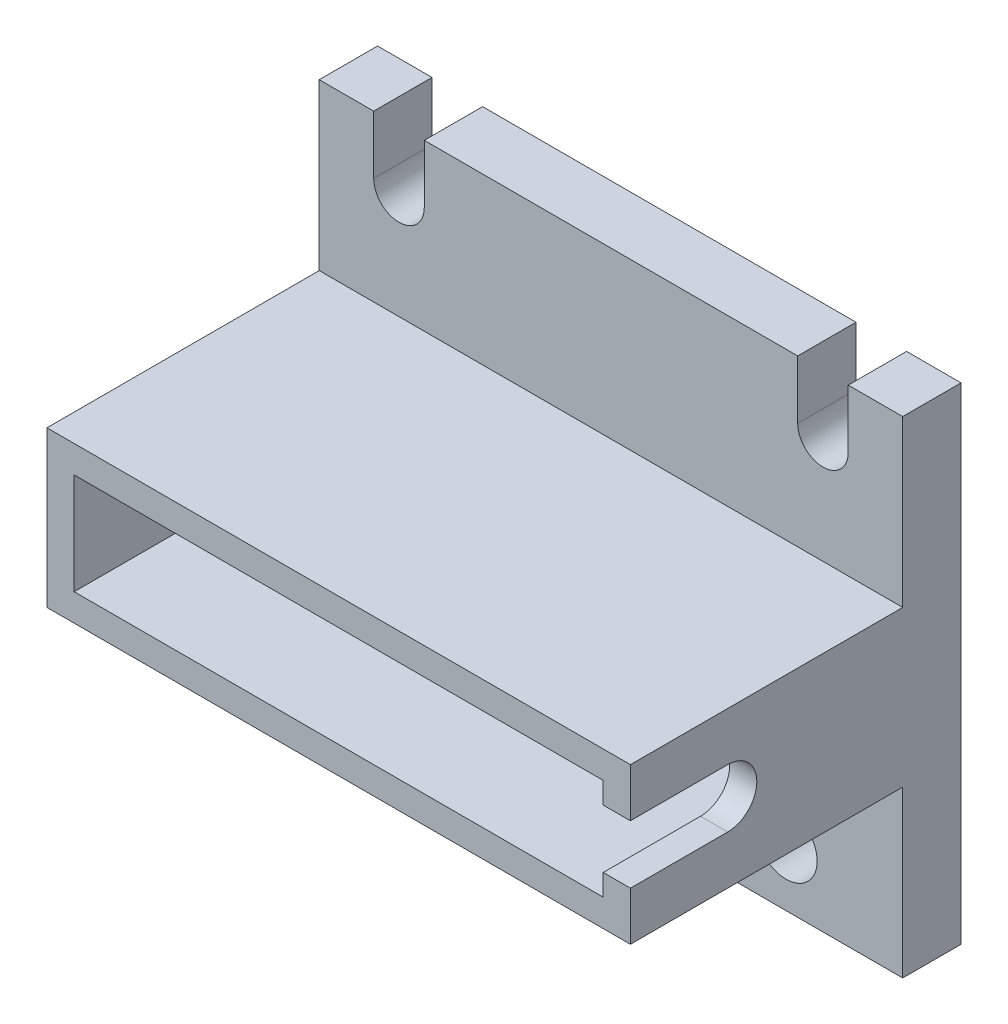
ISO-10303-21;
HEADER;
FILE_DESCRIPTION(('STEP AP214'),'2;1');
FILE_NAME('part.step','',(''),(''),'','','');
FILE_SCHEMA(('AUTOMOTIVE_DESIGN { 1 0 10303 214 1 1 1 1 }'));
ENDSEC;
DATA;
#1=APPLICATION_CONTEXT('core data for automotive mechanical design processes');
#2=APPLICATION_PROTOCOL_DEFINITION('international standard','automotive_design',2000,#1);
#3=PRODUCT_CONTEXT('',#1,'mechanical');
#4=PRODUCT('Part','Part','',(#3));
#5=PRODUCT_RELATED_PRODUCT_CATEGORY('part','',(#4));
#6=PRODUCT_DEFINITION_FORMATION('','',#4);
#7=PRODUCT_DEFINITION_CONTEXT('part definition',#1,'design');
#8=PRODUCT_DEFINITION('design','',#6,#7);
#9=PRODUCT_DEFINITION_SHAPE('','',#8);
#10=(LENGTH_UNIT() NAMED_UNIT(*) SI_UNIT(.MILLI.,.METRE.));
#11=(NAMED_UNIT(*) PLANE_ANGLE_UNIT() SI_UNIT($,.RADIAN.));
#12=(NAMED_UNIT(*) SI_UNIT($,.STERADIAN.) SOLID_ANGLE_UNIT());
#13=UNCERTAINTY_MEASURE_WITH_UNIT(LENGTH_MEASURE(1.E-05),#10,'distance_accuracy_value','');
#14=(GEOMETRIC_REPRESENTATION_CONTEXT(3) GLOBAL_UNCERTAINTY_ASSIGNED_CONTEXT((#13)) GLOBAL_UNIT_ASSIGNED_CONTEXT((#10,
#11,#12)) REPRESENTATION_CONTEXT('',''));
#15=CARTESIAN_POINT('',(0.,0.,0.));
#16=DIRECTION('',(0.,0.,1.));
#17=DIRECTION('',(1.,0.,0.));
#18=AXIS2_PLACEMENT_3D('',#15,#16,#17);
#19=CARTESIAN_POINT('',(-75.,62.5,15.));
#20=DIRECTION('',(0.,-1.,0.));
#21=DIRECTION('',(0.,0.,-1.));
#22=AXIS2_PLACEMENT_3D('',#19,#20,#21);
#23=PLANE('',#22);
#24=DIRECTION('',(-1.,0.,0.));
#25=VECTOR('',#24,1.);
#26=CARTESIAN_POINT('',(-75.,62.5,0.));
#27=LINE('',#26,#25);
#28=CARTESIAN_POINT('',(48.,62.5,0.));
#29=VERTEX_POINT('',#28);
#30=CARTESIAN_POINT('',(-48.,62.5,0.));
#31=VERTEX_POINT('',#30);
#32=EDGE_CURVE('E345',#29,#31,#27,.T.);
#33=ORIENTED_EDGE('',*,*,#32,.T.);
#34=DIRECTION('',(0.,0.,1.));
#35=VECTOR('',#34,1.);
#36=CARTESIAN_POINT('',(-48.,62.5,0.));
#37=LINE('',#36,#35);
#38=CARTESIAN_POINT('',(-48.,62.5,15.));
#39=VERTEX_POINT('',#38);
#40=EDGE_CURVE('E492',#31,#39,#37,.T.);
#41=ORIENTED_EDGE('',*,*,#40,.T.);
#42=DIRECTION('',(-1.,0.,0.));
#43=VECTOR('',#42,1.);
#44=CARTESIAN_POINT('',(-75.,62.5,15.));
#45=LINE('',#44,#43);
#46=CARTESIAN_POINT('',(48.,62.5,15.));
#47=VERTEX_POINT('',#46);
#48=EDGE_CURVE('E310',#47,#39,#45,.T.);
#49=ORIENTED_EDGE('',*,*,#48,.F.);
#50=DIRECTION('',(0.,0.,1.));
#51=VECTOR('',#50,1.);
#52=CARTESIAN_POINT('',(48.,62.5,0.));
#53=LINE('',#52,#51);
#54=EDGE_CURVE('E417',#29,#47,#53,.T.);
#55=ORIENTED_EDGE('',*,*,#54,.F.);
#56=EDGE_LOOP('',(#33,#41,#49,#55));
#57=FACE_BOUND('',#56,.T.);
#58=ADVANCED_FACE('F37',(#57),#23,.F.);
#59=CARTESIAN_POINT('',(0.,0.,15.));
#60=DIRECTION('',(0.,0.,-1.));
#61=DIRECTION('',(-1.,0.,0.));
#62=AXIS2_PLACEMENT_3D('',#59,#60,#61);
#63=PLANE('',#62);
#64=DIRECTION('',(0.,-1.,0.));
#65=VECTOR('',#64,1.);
#66=CARTESIAN_POINT('',(-10.,0.,15.));
#67=LINE('',#66,#65);
#68=CARTESIAN_POINT('',(-9.99999999999999,-20.,15.));
#69=VERTEX_POINT('',#68);
#70=CARTESIAN_POINT('',(-10.,-62.5,15.));
#71=VERTEX_POINT('',#70);
#72=EDGE_CURVE('E391',#69,#71,#67,.T.);
#73=ORIENTED_EDGE('',*,*,#72,.F.);
#74=DIRECTION('',(1.,0.,0.));
#75=VECTOR('',#74,1.);
#76=CARTESIAN_POINT('',(-75.,-20.,15.));
#77=LINE('',#76,#75);
#78=CARTESIAN_POINT('',(-75.,-20.,15.));
#79=VERTEX_POINT('',#78);
#80=EDGE_CURVE('E245',#79,#69,#77,.T.);
#81=ORIENTED_EDGE('',*,*,#80,.F.);
#82=DIRECTION('',(0.,-1.,0.));
#83=VECTOR('',#82,1.);
#84=CARTESIAN_POINT('',(-75.,-62.5,15.));
#85=LINE('',#84,#83);
#86=CARTESIAN_POINT('',(-75.,-62.5,15.));
#87=VERTEX_POINT('',#86);
#88=EDGE_CURVE('E271',#79,#87,#85,.T.);
#89=ORIENTED_EDGE('',*,*,#88,.T.);
#90=DIRECTION('',(1.,0.,0.));
#91=VECTOR('',#90,1.);
#92=CARTESIAN_POINT('',(-75.,-62.5,15.));
#93=LINE('',#92,#91);
#94=EDGE_CURVE('E334',#87,#71,#93,.T.);
#95=ORIENTED_EDGE('',*,*,#94,.T.);
#96=EDGE_LOOP('',(#73,#81,#89,#95));
#97=FACE_BOUND('',#96,.T.);
#98=CARTESIAN_POINT('',(-45.,-47.5,15.));
#99=DIRECTION('',(0.,0.,-1.));
#100=DIRECTION('',(-1.,0.,0.));
#101=AXIS2_PLACEMENT_3D('',#98,#99,#100);
#102=CIRCLE('',#101,8.);
#103=CARTESIAN_POINT('',(-53.,-47.5,15.));
#104=VERTEX_POINT('',#103);
#105=EDGE_CURVE('E501',#104,#104,#102,.T.);
#106=ORIENTED_EDGE('',*,*,#105,.T.);
#107=EDGE_LOOP('',(#106));
#108=FACE_BOUND('',#107,.T.);
#109=ADVANCED_FACE('F389',(#97,#108),#63,.F.);
#110=CARTESIAN_POINT('',(0.,0.,0.));
#111=DIRECTION('',(0.,0.,-1.));
#112=DIRECTION('',(-1.,0.,0.));
#113=AXIS2_PLACEMENT_3D('',#110,#111,#112);
#114=PLANE('',#113);
#115=DIRECTION('',(0.,1.,0.));
#116=VECTOR('',#115,1.);
#117=CARTESIAN_POINT('',(-48.,0.,0.));
#118=LINE('',#117,#116);
#119=CARTESIAN_POINT('',(-48.,47.5,0.));
#120=VERTEX_POINT('',#119);
#121=EDGE_CURVE('E486',#120,#31,#118,.T.);
#122=ORIENTED_EDGE('',*,*,#121,.T.);
#123=ORIENTED_EDGE('',*,*,#32,.F.);
#124=DIRECTION('',(0.,1.,0.));
#125=VECTOR('',#124,1.);
#126=CARTESIAN_POINT('',(48.,0.,0.));
#127=LINE('',#126,#125);
#128=CARTESIAN_POINT('',(48.,47.5,0.));
#129=VERTEX_POINT('',#128);
#130=EDGE_CURVE('E401',#129,#29,#127,.T.);
#131=ORIENTED_EDGE('',*,*,#130,.F.);
#132=CARTESIAN_POINT('',(54.5,47.5,0.));
#133=DIRECTION('',(0.,0.,1.));
#134=DIRECTION('',(1.,0.,0.));
#135=AXIS2_PLACEMENT_3D('',#132,#133,#134);
#136=CIRCLE('',#135,6.5);
#137=CARTESIAN_POINT('',(61.,47.5,0.));
#138=VERTEX_POINT('',#137);
#139=EDGE_CURVE('E403',#129,#138,#136,.T.);
#140=ORIENTED_EDGE('',*,*,#139,.T.);
#141=DIRECTION('',(0.,-1.,0.));
#142=VECTOR('',#141,1.);
#143=CARTESIAN_POINT('',(61.,0.,0.));
#144=LINE('',#143,#142);
#145=CARTESIAN_POINT('',(61.,62.5,0.));
#146=VERTEX_POINT('',#145);
#147=EDGE_CURVE('E407',#146,#138,#144,.T.);
#148=ORIENTED_EDGE('',*,*,#147,.F.);
#149=CARTESIAN_POINT('',(75.,62.5,0.));
#150=VERTEX_POINT('',#149);
#151=EDGE_CURVE('E341',#150,#146,#27,.T.);
#152=ORIENTED_EDGE('',*,*,#151,.F.);
#153=DIRECTION('',(0.,1.,0.));
#154=VECTOR('',#153,1.);
#155=CARTESIAN_POINT('',(75.,-62.5,0.));
#156=LINE('',#155,#154);
#157=CARTESIAN_POINT('',(75.,-62.5,0.));
#158=VERTEX_POINT('',#157);
#159=EDGE_CURVE('E281',#158,#150,#156,.T.);
#160=ORIENTED_EDGE('',*,*,#159,.F.);
#161=DIRECTION('',(1.,0.,0.));
#162=VECTOR('',#161,1.);
#163=CARTESIAN_POINT('',(-75.,-62.5,0.));
#164=LINE('',#163,#162);
#165=CARTESIAN_POINT('',(-75.,-62.5,0.));
#166=VERTEX_POINT('',#165);
#167=EDGE_CURVE('E327',#166,#158,#164,.T.);
#168=ORIENTED_EDGE('',*,*,#167,.F.);
#169=DIRECTION('',(0.,-1.,0.));
#170=VECTOR('',#169,1.);
#171=CARTESIAN_POINT('',(-75.,-62.5,0.));
#172=LINE('',#171,#170);
#173=CARTESIAN_POINT('',(-75.,62.5,0.));
#174=VERTEX_POINT('',#173);
#175=EDGE_CURVE('E344',#174,#166,#172,.T.);
#176=ORIENTED_EDGE('',*,*,#175,.F.);
#177=CARTESIAN_POINT('',(-61.,62.5,0.));
#178=VERTEX_POINT('',#177);
#179=EDGE_CURVE('E340',#178,#174,#27,.T.);
#180=ORIENTED_EDGE('',*,*,#179,.F.);
#181=DIRECTION('',(0.,-1.,0.));
#182=VECTOR('',#181,1.);
#183=CARTESIAN_POINT('',(-61.,0.,0.));
#184=LINE('',#183,#182);
#185=CARTESIAN_POINT('',(-61.,47.5,0.));
#186=VERTEX_POINT('',#185);
#187=EDGE_CURVE('E63',#178,#186,#184,.T.);
#188=ORIENTED_EDGE('',*,*,#187,.T.);
#189=CARTESIAN_POINT('',(-54.5,47.5,0.));
#190=DIRECTION('',(0.,0.,-1.));
#191=DIRECTION('',(-1.,0.,0.));
#192=AXIS2_PLACEMENT_3D('',#189,#190,#191);
#193=CIRCLE('',#192,6.5);
#194=EDGE_CURVE('E490',#120,#186,#193,.T.);
#195=ORIENTED_EDGE('',*,*,#194,.F.);
#196=EDGE_LOOP('',(#122,#123,#131,#140,#148,#152,#160,#168,#176,#180,#188,#195));
#197=FACE_BOUND('',#196,.T.);
#198=CARTESIAN_POINT('',(45.,-47.5,0.));
#199=DIRECTION('',(0.,0.,1.));
#200=DIRECTION('',(1.,0.,0.));
#201=AXIS2_PLACEMENT_3D('',#198,#199,#200);
#202=CIRCLE('',#201,8.);
#203=CARTESIAN_POINT('',(53.,-47.5,0.));
#204=VERTEX_POINT('',#203);
#205=EDGE_CURVE('E426',#204,#204,#202,.T.);
#206=ORIENTED_EDGE('',*,*,#205,.T.);
#207=EDGE_LOOP('',(#206));
#208=FACE_BOUND('',#207,.T.);
#209=DIRECTION('',(-1.,0.,0.));
#210=VECTOR('',#209,1.);
#211=CARTESIAN_POINT('',(0.,13.,0.));
#212=LINE('',#211,#210);
#213=CARTESIAN_POINT('',(68.,13.,0.));
#214=VERTEX_POINT('',#213);
#215=CARTESIAN_POINT('',(-68.,13.,0.));
#216=VERTEX_POINT('',#215);
#217=EDGE_CURVE('E438',#214,#216,#212,.T.);
#218=ORIENTED_EDGE('',*,*,#217,.T.);
#219=DIRECTION('',(0.,-1.,0.));
#220=VECTOR('',#219,1.);
#221=CARTESIAN_POINT('',(-68.,0.,0.));
#222=LINE('',#221,#220);
#223=CARTESIAN_POINT('',(-68.,-13.,0.));
#224=VERTEX_POINT('',#223);
#225=EDGE_CURVE('E440',#216,#224,#222,.T.);
#226=ORIENTED_EDGE('',*,*,#225,.T.);
#227=DIRECTION('',(1.,0.,0.));
#228=VECTOR('',#227,1.);
#229=CARTESIAN_POINT('',(0.,-13.,0.));
#230=LINE('',#229,#228);
#231=CARTESIAN_POINT('',(68.,-13.,0.));
#232=VERTEX_POINT('',#231);
#233=EDGE_CURVE('E432',#224,#232,#230,.T.);
#234=ORIENTED_EDGE('',*,*,#233,.T.);
#235=DIRECTION('',(0.,1.,0.));
#236=VECTOR('',#235,1.);
#237=CARTESIAN_POINT('',(68.,0.,0.));
#238=LINE('',#237,#236);
#239=EDGE_CURVE('E434',#232,#214,#238,.T.);
#240=ORIENTED_EDGE('',*,*,#239,.T.);
#241=EDGE_LOOP('',(#218,#226,#234,#240));
#242=FACE_BOUND('',#241,.T.);
#243=CARTESIAN_POINT('',(-45.,-47.5,0.));
#244=DIRECTION('',(0.,0.,-1.));
#245=DIRECTION('',(-1.,0.,0.));
#246=AXIS2_PLACEMENT_3D('',#243,#244,#245);
#247=CIRCLE('',#246,8.);
#248=CARTESIAN_POINT('',(-53.,-47.5,0.));
#249=VERTEX_POINT('',#248);
#250=EDGE_CURVE('E508',#249,#249,#247,.T.);
#251=ORIENTED_EDGE('',*,*,#250,.F.);
#252=EDGE_LOOP('',(#251));
#253=FACE_BOUND('',#252,.T.);
#254=ADVANCED_FACE('F358',(#197,#208,#242,#253),#114,.T.);
#255=CARTESIAN_POINT('',(-75.,-20.,85.));
#256=DIRECTION('',(0.,1.,0.));
#257=DIRECTION('',(0.,0.,1.));
#258=AXIS2_PLACEMENT_3D('',#255,#256,#257);
#259=PLANE('',#258);
#260=DIRECTION('',(0.,0.,-1.));
#261=VECTOR('',#260,1.);
#262=CARTESIAN_POINT('',(-9.99999999999999,-20.,85.));
#263=LINE('',#262,#261);
#264=CARTESIAN_POINT('',(-10.,-20.,85.));
#265=VERTEX_POINT('',#264);
#266=EDGE_CURVE('E394',#265,#69,#263,.T.);
#267=ORIENTED_EDGE('',*,*,#266,.F.);
#268=DIRECTION('',(1.,0.,0.));
#269=VECTOR('',#268,1.);
#270=CARTESIAN_POINT('',(-75.,-20.,85.));
#271=LINE('',#270,#269);
#272=CARTESIAN_POINT('',(-75.,-20.,85.));
#273=VERTEX_POINT('',#272);
#274=EDGE_CURVE('E258',#273,#265,#271,.T.);
#275=ORIENTED_EDGE('',*,*,#274,.F.);
#276=DIRECTION('',(0.,0.,-1.));
#277=VECTOR('',#276,1.);
#278=CARTESIAN_POINT('',(-75.,-20.,85.));
#279=LINE('',#278,#277);
#280=EDGE_CURVE('E277',#273,#79,#279,.T.);
#281=ORIENTED_EDGE('',*,*,#280,.T.);
#282=ORIENTED_EDGE('',*,*,#80,.T.);
#283=EDGE_LOOP('',(#267,#275,#281,#282));
#284=FACE_BOUND('',#283,.T.);
#285=ADVANCED_FACE('F294',(#284),#259,.F.);
#286=ORIENTED_EDGE('',*,*,#48,.T.);
#287=DIRECTION('',(0.,1.,0.));
#288=VECTOR('',#287,1.);
#289=CARTESIAN_POINT('',(-48.,0.,15.));
#290=LINE('',#289,#288);
#291=CARTESIAN_POINT('',(-48.,47.5,15.));
#292=VERTEX_POINT('',#291);
#293=EDGE_CURVE('E485',#292,#39,#290,.T.);
#294=ORIENTED_EDGE('',*,*,#293,.F.);
#295=CARTESIAN_POINT('',(-54.5,47.5,15.));
#296=DIRECTION('',(0.,0.,-1.));
#297=DIRECTION('',(-1.,0.,0.));
#298=AXIS2_PLACEMENT_3D('',#295,#296,#297);
#299=CIRCLE('',#298,6.5);
#300=CARTESIAN_POINT('',(-61.,47.5,15.));
#301=VERTEX_POINT('',#300);
#302=EDGE_CURVE('E488',#292,#301,#299,.T.);
#303=ORIENTED_EDGE('',*,*,#302,.T.);
#304=DIRECTION('',(0.,-1.,0.));
#305=VECTOR('',#304,1.);
#306=CARTESIAN_POINT('',(-61.,0.,15.));
#307=LINE('',#306,#305);
#308=CARTESIAN_POINT('',(-61.,62.5,15.));
#309=VERTEX_POINT('',#308);
#310=EDGE_CURVE('E494',#309,#301,#307,.T.);
#311=ORIENTED_EDGE('',*,*,#310,.F.);
#312=CARTESIAN_POINT('',(-75.,62.5,15.));
#313=VERTEX_POINT('',#312);
#314=EDGE_CURVE('E312',#309,#313,#45,.T.);
#315=ORIENTED_EDGE('',*,*,#314,.T.);
#316=CARTESIAN_POINT('',(-75.,20.,15.));
#317=VERTEX_POINT('',#316);
#318=EDGE_CURVE('E305',#313,#317,#85,.T.);
#319=ORIENTED_EDGE('',*,*,#318,.T.);
#320=DIRECTION('',(-1.,0.,0.));
#321=VECTOR('',#320,1.);
#322=CARTESIAN_POINT('',(-75.,20.,15.));
#323=LINE('',#322,#321);
#324=CARTESIAN_POINT('',(75.,20.,15.));
#325=VERTEX_POINT('',#324);
#326=EDGE_CURVE('E267',#325,#317,#323,.T.);
#327=ORIENTED_EDGE('',*,*,#326,.F.);
#328=DIRECTION('',(0.,1.,0.));
#329=VECTOR('',#328,1.);
#330=CARTESIAN_POINT('',(75.,-62.5,15.));
#331=LINE('',#330,#329);
#332=CARTESIAN_POINT('',(75.,62.5,15.));
#333=VERTEX_POINT('',#332);
#334=EDGE_CURVE('E322',#325,#333,#331,.T.);
#335=ORIENTED_EDGE('',*,*,#334,.T.);
#336=CARTESIAN_POINT('',(61.,62.5,15.));
#337=VERTEX_POINT('',#336);
#338=EDGE_CURVE('E306',#333,#337,#45,.T.);
#339=ORIENTED_EDGE('',*,*,#338,.T.);
#340=DIRECTION('',(0.,-1.,0.));
#341=VECTOR('',#340,1.);
#342=CARTESIAN_POINT('',(61.,0.,15.));
#343=LINE('',#342,#341);
#344=CARTESIAN_POINT('',(61.,47.5,15.));
#345=VERTEX_POINT('',#344);
#346=EDGE_CURVE('E404',#337,#345,#343,.T.);
#347=ORIENTED_EDGE('',*,*,#346,.T.);
#348=CARTESIAN_POINT('',(54.5,47.5,15.));
#349=DIRECTION('',(0.,0.,1.));
#350=DIRECTION('',(1.,0.,0.));
#351=AXIS2_PLACEMENT_3D('',#348,#349,#350);
#352=CIRCLE('',#351,6.5);
#353=CARTESIAN_POINT('',(48.,47.5,15.));
#354=VERTEX_POINT('',#353);
#355=EDGE_CURVE('E413',#354,#345,#352,.T.);
#356=ORIENTED_EDGE('',*,*,#355,.F.);
#357=DIRECTION('',(0.,1.,0.));
#358=VECTOR('',#357,1.);
#359=CARTESIAN_POINT('',(48.,0.,15.));
#360=LINE('',#359,#358);
#361=EDGE_CURVE('E386',#354,#47,#360,.T.);
#362=ORIENTED_EDGE('',*,*,#361,.T.);
#363=EDGE_LOOP('',(#286,#294,#303,#311,#315,#319,#327,#335,#339,#347,#356,#362));
#364=FACE_BOUND('',#363,.T.);
#365=ADVANCED_FACE('F519',(#364),#63,.F.);
#366=ORIENTED_EDGE('',*,*,#314,.F.);
#367=DIRECTION('',(0.,0.,1.));
#368=VECTOR('',#367,1.);
#369=CARTESIAN_POINT('',(-61.,62.5,0.));
#370=LINE('',#369,#368);
#371=EDGE_CURVE('E504',#178,#309,#370,.T.);
#372=ORIENTED_EDGE('',*,*,#371,.F.);
#373=ORIENTED_EDGE('',*,*,#179,.T.);
#374=DIRECTION('',(0.,0.,-1.));
#375=VECTOR('',#374,1.);
#376=CARTESIAN_POINT('',(-75.,62.5,15.));
#377=LINE('',#376,#375);
#378=EDGE_CURVE('E47',#313,#174,#377,.T.);
#379=ORIENTED_EDGE('',*,*,#378,.F.);
#380=EDGE_LOOP('',(#366,#372,#373,#379));
#381=FACE_BOUND('',#380,.T.);
#382=ADVANCED_FACE('F523',(#381),#23,.F.);
#383=DIRECTION('',(0.,0.,1.));
#384=VECTOR('',#383,1.);
#385=CARTESIAN_POINT('',(61.,62.5,0.));
#386=LINE('',#385,#384);
#387=EDGE_CURVE('E420',#146,#337,#386,.T.);
#388=ORIENTED_EDGE('',*,*,#387,.T.);
#389=ORIENTED_EDGE('',*,*,#338,.F.);
#390=DIRECTION('',(0.,0.,-1.));
#391=VECTOR('',#390,1.);
#392=CARTESIAN_POINT('',(75.,62.5,15.));
#393=LINE('',#392,#391);
#394=EDGE_CURVE('E11',#333,#150,#393,.T.);
#395=ORIENTED_EDGE('',*,*,#394,.T.);
#396=ORIENTED_EDGE('',*,*,#151,.T.);
#397=EDGE_LOOP('',(#388,#389,#395,#396));
#398=FACE_BOUND('',#397,.T.);
#399=ADVANCED_FACE('F529',(#398),#23,.F.);
#400=CARTESIAN_POINT('',(45.,-47.5,15.));
#401=DIRECTION('',(0.,0.,1.));
#402=DIRECTION('',(1.,0.,0.));
#403=AXIS2_PLACEMENT_3D('',#400,#401,#402);
#404=CIRCLE('',#403,8.);
#405=CARTESIAN_POINT('',(53.,-47.5,15.));
#406=VERTEX_POINT('',#405);
#407=EDGE_CURVE('E419',#406,#406,#404,.T.);
#408=ORIENTED_EDGE('',*,*,#407,.F.);
#409=EDGE_LOOP('',(#408));
#410=FACE_BOUND('',#409,.T.);
#411=CARTESIAN_POINT('',(9.99999999999999,-20.,15.));
#412=VERTEX_POINT('',#411);
#413=CARTESIAN_POINT('',(75.,-20.,15.));
#414=VERTEX_POINT('',#413);
#415=EDGE_CURVE('E41',#412,#414,#77,.T.);
#416=ORIENTED_EDGE('',*,*,#415,.F.);
#417=DIRECTION('',(0.,-1.,0.));
#418=VECTOR('',#417,1.);
#419=CARTESIAN_POINT('',(10.,0.,15.));
#420=LINE('',#419,#418);
#421=CARTESIAN_POINT('',(10.,-62.5,15.));
#422=VERTEX_POINT('',#421);
#423=EDGE_CURVE('E378',#412,#422,#420,.T.);
#424=ORIENTED_EDGE('',*,*,#423,.T.);
#425=CARTESIAN_POINT('',(75.,-62.5,15.));
#426=VERTEX_POINT('',#425);
#427=EDGE_CURVE('E308',#422,#426,#93,.T.);
#428=ORIENTED_EDGE('',*,*,#427,.T.);
#429=EDGE_CURVE('E317',#426,#414,#331,.T.);
#430=ORIENTED_EDGE('',*,*,#429,.T.);
#431=EDGE_LOOP('',(#416,#424,#428,#430));
#432=FACE_BOUND('',#431,.T.);
#433=ADVANCED_FACE('F377',(#410,#432),#63,.F.);
#434=CARTESIAN_POINT('',(75.,-62.5,15.));
#435=DIRECTION('',(-1.,0.,0.));
#436=DIRECTION('',(0.,0.,1.));
#437=AXIS2_PLACEMENT_3D('',#434,#435,#436);
#438=PLANE('',#437);
#439=CARTESIAN_POINT('',(75.,0.,60.));
#440=DIRECTION('',(1.,0.,0.));
#441=DIRECTION('',(0.,0.,-1.));
#442=AXIS2_PLACEMENT_3D('',#439,#440,#441);
#443=CIRCLE('',#442,7.5);
#444=CARTESIAN_POINT('',(75.,-7.5,60.));
#445=VERTEX_POINT('',#444);
#446=CARTESIAN_POINT('',(75.,7.5,60.));
#447=VERTEX_POINT('',#446);
#448=EDGE_CURVE('E227',#445,#447,#443,.T.);
#449=ORIENTED_EDGE('',*,*,#448,.F.);
#450=DIRECTION('',(0.,0.,-1.));
#451=VECTOR('',#450,1.);
#452=CARTESIAN_POINT('',(75.,-7.5,85.));
#453=LINE('',#452,#451);
#454=CARTESIAN_POINT('',(75.,-7.5,85.));
#455=VERTEX_POINT('',#454);
#456=EDGE_CURVE('E478',#455,#445,#453,.T.);
#457=ORIENTED_EDGE('',*,*,#456,.F.);
#458=DIRECTION('',(0.,1.,0.));
#459=VECTOR('',#458,1.);
#460=CARTESIAN_POINT('',(75.,-20.,85.));
#461=LINE('',#460,#459);
#462=CARTESIAN_POINT('',(75.,-20.,85.));
#463=VERTEX_POINT('',#462);
#464=EDGE_CURVE('E244',#463,#455,#461,.T.);
#465=ORIENTED_EDGE('',*,*,#464,.F.);
#466=DIRECTION('',(0.,0.,-1.));
#467=VECTOR('',#466,1.);
#468=CARTESIAN_POINT('',(75.,-20.,85.));
#469=LINE('',#468,#467);
#470=EDGE_CURVE('E261',#463,#414,#469,.T.);
#471=ORIENTED_EDGE('',*,*,#470,.T.);
#472=ORIENTED_EDGE('',*,*,#429,.F.);
#473=DIRECTION('',(0.,0.,-1.));
#474=VECTOR('',#473,1.);
#475=CARTESIAN_POINT('',(75.,-62.5,15.));
#476=LINE('',#475,#474);
#477=EDGE_CURVE('E337',#426,#158,#476,.T.);
#478=ORIENTED_EDGE('',*,*,#477,.T.);
#479=ORIENTED_EDGE('',*,*,#159,.T.);
#480=ORIENTED_EDGE('',*,*,#394,.F.);
#481=ORIENTED_EDGE('',*,*,#334,.F.);
#482=DIRECTION('',(0.,0.,-1.));
#483=VECTOR('',#482,1.);
#484=CARTESIAN_POINT('',(75.,20.,85.));
#485=LINE('',#484,#483);
#486=CARTESIAN_POINT('',(75.,20.,85.));
#487=VERTEX_POINT('',#486);
#488=EDGE_CURVE('E243',#487,#325,#485,.T.);
#489=ORIENTED_EDGE('',*,*,#488,.F.);
#490=CARTESIAN_POINT('',(75.,7.5,85.));
#491=VERTEX_POINT('',#490);
#492=EDGE_CURVE('E233',#491,#487,#461,.T.);
#493=ORIENTED_EDGE('',*,*,#492,.F.);
#494=DIRECTION('',(0.,0.,1.));
#495=VECTOR('',#494,1.);
#496=CARTESIAN_POINT('',(75.,7.5,85.));
#497=LINE('',#496,#495);
#498=EDGE_CURVE('E219',#447,#491,#497,.T.);
#499=ORIENTED_EDGE('',*,*,#498,.F.);
#500=EDGE_LOOP('',(#449,#457,#465,#471,#472,#478,#479,#480,#481,#489,#493,#499));
#501=FACE_BOUND('',#500,.T.);
#502=ADVANCED_FACE('F39',(#501),#438,.F.);
#503=CARTESIAN_POINT('',(-75.,-62.5,15.));
#504=DIRECTION('',(1.,0.,0.));
#505=DIRECTION('',(0.,0.,-1.));
#506=AXIS2_PLACEMENT_3D('',#503,#504,#505);
#507=PLANE('',#506);
#508=ORIENTED_EDGE('',*,*,#175,.T.);
#509=DIRECTION('',(0.,0.,-1.));
#510=VECTOR('',#509,1.);
#511=CARTESIAN_POINT('',(-75.,-62.5,15.));
#512=LINE('',#511,#510);
#513=EDGE_CURVE('E301',#87,#166,#512,.T.);
#514=ORIENTED_EDGE('',*,*,#513,.F.);
#515=ORIENTED_EDGE('',*,*,#88,.F.);
#516=ORIENTED_EDGE('',*,*,#280,.F.);
#517=DIRECTION('',(0.,-1.,0.));
#518=VECTOR('',#517,1.);
#519=CARTESIAN_POINT('',(-75.,-20.,85.));
#520=LINE('',#519,#518);
#521=CARTESIAN_POINT('',(-75.,20.,85.));
#522=VERTEX_POINT('',#521);
#523=EDGE_CURVE('E255',#522,#273,#520,.T.);
#524=ORIENTED_EDGE('',*,*,#523,.F.);
#525=DIRECTION('',(0.,0.,-1.));
#526=VECTOR('',#525,1.);
#527=CARTESIAN_POINT('',(-75.,20.,85.));
#528=LINE('',#527,#526);
#529=EDGE_CURVE('E274',#522,#317,#528,.T.);
#530=ORIENTED_EDGE('',*,*,#529,.T.);
#531=ORIENTED_EDGE('',*,*,#318,.F.);
#532=ORIENTED_EDGE('',*,*,#378,.T.);
#533=EDGE_LOOP('',(#508,#514,#515,#516,#524,#530,#531,#532));
#534=FACE_BOUND('',#533,.T.);
#535=ADVANCED_FACE('F298',(#534),#507,.F.);
#536=CARTESIAN_POINT('',(-75.,-62.5,15.));
#537=DIRECTION('',(0.,1.,0.));
#538=DIRECTION('',(0.,0.,1.));
#539=AXIS2_PLACEMENT_3D('',#536,#537,#538);
#540=PLANE('',#539);
#541=ORIENTED_EDGE('',*,*,#427,.F.);
#542=DIRECTION('',(1.,0.,0.));
#543=VECTOR('',#542,1.);
#544=CARTESIAN_POINT('',(-75.,-62.5,15.));
#545=LINE('',#544,#543);
#546=EDGE_CURVE('E381',#71,#422,#545,.T.);
#547=ORIENTED_EDGE('',*,*,#546,.F.);
#548=ORIENTED_EDGE('',*,*,#94,.F.);
#549=ORIENTED_EDGE('',*,*,#513,.T.);
#550=ORIENTED_EDGE('',*,*,#167,.T.);
#551=ORIENTED_EDGE('',*,*,#477,.F.);
#552=EDGE_LOOP('',(#541,#547,#548,#549,#550,#551));
#553=FACE_BOUND('',#552,.T.);
#554=ADVANCED_FACE('F364',(#553),#540,.F.);
#555=CARTESIAN_POINT('',(-75.,20.,85.));
#556=DIRECTION('',(0.,-1.,0.));
#557=DIRECTION('',(0.,0.,-1.));
#558=AXIS2_PLACEMENT_3D('',#555,#556,#557);
#559=PLANE('',#558);
#560=ORIENTED_EDGE('',*,*,#326,.T.);
#561=ORIENTED_EDGE('',*,*,#529,.F.);
#562=DIRECTION('',(-1.,0.,0.));
#563=VECTOR('',#562,1.);
#564=CARTESIAN_POINT('',(-75.,20.,85.));
#565=LINE('',#564,#563);
#566=EDGE_CURVE('E247',#487,#522,#565,.T.);
#567=ORIENTED_EDGE('',*,*,#566,.F.);
#568=ORIENTED_EDGE('',*,*,#488,.T.);
#569=EDGE_LOOP('',(#560,#561,#567,#568));
#570=FACE_BOUND('',#569,.T.);
#571=ADVANCED_FACE('F518',(#570),#559,.F.);
#572=CARTESIAN_POINT('',(9.99999999999999,-20.,85.));
#573=VERTEX_POINT('',#572);
#574=EDGE_CURVE('E257',#573,#463,#271,.T.);
#575=ORIENTED_EDGE('',*,*,#574,.F.);
#576=DIRECTION('',(0.,0.,-1.));
#577=VECTOR('',#576,1.);
#578=CARTESIAN_POINT('',(9.99999999999999,-20.,85.));
#579=LINE('',#578,#577);
#580=EDGE_CURVE('E375',#573,#412,#579,.T.);
#581=ORIENTED_EDGE('',*,*,#580,.T.);
#582=ORIENTED_EDGE('',*,*,#415,.T.);
#583=ORIENTED_EDGE('',*,*,#470,.F.);
#584=EDGE_LOOP('',(#575,#581,#582,#583));
#585=FACE_BOUND('',#584,.T.);
#586=ADVANCED_FACE('F371',(#585),#259,.F.);
#587=CARTESIAN_POINT('',(0.,0.,85.));
#588=DIRECTION('',(0.,0.,-1.));
#589=DIRECTION('',(-1.,0.,0.));
#590=AXIS2_PLACEMENT_3D('',#587,#588,#589);
#591=PLANE('',#590);
#592=ORIENTED_EDGE('',*,*,#464,.T.);
#593=DIRECTION('',(1.,0.,0.));
#594=VECTOR('',#593,1.);
#595=CARTESIAN_POINT('',(-75.00105,-7.5,85.));
#596=LINE('',#595,#594);
#597=CARTESIAN_POINT('',(68.,-7.5,85.));
#598=VERTEX_POINT('',#597);
#599=EDGE_CURVE('E238',#598,#455,#596,.T.);
#600=ORIENTED_EDGE('',*,*,#599,.F.);
#601=DIRECTION('',(0.,1.,0.));
#602=VECTOR('',#601,1.);
#603=CARTESIAN_POINT('',(68.,0.,85.));
#604=LINE('',#603,#602);
#605=CARTESIAN_POINT('',(68.,-13.,85.));
#606=VERTEX_POINT('',#605);
#607=EDGE_CURVE('E444',#606,#598,#604,.T.);
#608=ORIENTED_EDGE('',*,*,#607,.F.);
#609=DIRECTION('',(1.,0.,0.));
#610=VECTOR('',#609,1.);
#611=CARTESIAN_POINT('',(0.,-13.,85.));
#612=LINE('',#611,#610);
#613=CARTESIAN_POINT('',(-68.,-13.,85.));
#614=VERTEX_POINT('',#613);
#615=EDGE_CURVE('E429',#614,#606,#612,.T.);
#616=ORIENTED_EDGE('',*,*,#615,.F.);
#617=DIRECTION('',(0.,-1.,0.));
#618=VECTOR('',#617,1.);
#619=CARTESIAN_POINT('',(-68.,0.,85.));
#620=LINE('',#619,#618);
#621=CARTESIAN_POINT('',(-68.,13.,85.));
#622=VERTEX_POINT('',#621);
#623=EDGE_CURVE('E435',#622,#614,#620,.T.);
#624=ORIENTED_EDGE('',*,*,#623,.F.);
#625=DIRECTION('',(-1.,0.,0.));
#626=VECTOR('',#625,1.);
#627=CARTESIAN_POINT('',(0.,13.,85.));
#628=LINE('',#627,#626);
#629=CARTESIAN_POINT('',(68.,13.,85.));
#630=VERTEX_POINT('',#629);
#631=EDGE_CURVE('E447',#630,#622,#628,.T.);
#632=ORIENTED_EDGE('',*,*,#631,.F.);
#633=CARTESIAN_POINT('',(68.,7.5,85.));
#634=VERTEX_POINT('',#633);
#635=EDGE_CURVE('E236',#634,#630,#604,.T.);
#636=ORIENTED_EDGE('',*,*,#635,.F.);
#637=DIRECTION('',(-1.,0.,0.));
#638=VECTOR('',#637,1.);
#639=CARTESIAN_POINT('',(-75.00105,7.5,85.));
#640=LINE('',#639,#638);
#641=EDGE_CURVE('E55',#491,#634,#640,.T.);
#642=ORIENTED_EDGE('',*,*,#641,.F.);
#643=ORIENTED_EDGE('',*,*,#492,.T.);
#644=ORIENTED_EDGE('',*,*,#566,.T.);
#645=ORIENTED_EDGE('',*,*,#523,.T.);
#646=ORIENTED_EDGE('',*,*,#274,.T.);
#647=EDGE_CURVE('E262',#265,#573,#271,.T.);
#648=ORIENTED_EDGE('',*,*,#647,.T.);
#649=ORIENTED_EDGE('',*,*,#574,.T.);
#650=EDGE_LOOP('',(#592,#600,#608,#616,#624,#632,#636,#642,#643,#644,#645,#646,#648,#649));
#651=FACE_BOUND('',#650,.T.);
#652=ADVANCED_FACE('F232',(#651),#591,.F.);
#653=CARTESIAN_POINT('',(0.,-13.,0.));
#654=DIRECTION('',(0.,-1.,0.));
#655=DIRECTION('',(1.,0.,0.));
#656=AXIS2_PLACEMENT_3D('',#653,#654,#655);
#657=PLANE('',#656);
#658=DIRECTION('',(0.,0.,1.));
#659=VECTOR('',#658,1.);
#660=CARTESIAN_POINT('',(68.,-13.,0.));
#661=LINE('',#660,#659);
#662=EDGE_CURVE('E252',#232,#606,#661,.T.);
#663=ORIENTED_EDGE('',*,*,#662,.F.);
#664=ORIENTED_EDGE('',*,*,#233,.F.);
#665=DIRECTION('',(0.,0.,1.));
#666=VECTOR('',#665,1.);
#667=CARTESIAN_POINT('',(-68.,-13.,0.));
#668=LINE('',#667,#666);
#669=EDGE_CURVE('E270',#224,#614,#668,.T.);
#670=ORIENTED_EDGE('',*,*,#669,.T.);
#671=ORIENTED_EDGE('',*,*,#615,.T.);
#672=EDGE_LOOP('',(#663,#664,#670,#671));
#673=FACE_BOUND('',#672,.T.);
#674=ADVANCED_FACE('F605',(#673),#657,.F.);
#675=CARTESIAN_POINT('',(-68.,0.,0.));
#676=DIRECTION('',(-1.,0.,0.));
#677=DIRECTION('',(0.,0.,1.));
#678=AXIS2_PLACEMENT_3D('',#675,#676,#677);
#679=PLANE('',#678);
#680=ORIENTED_EDGE('',*,*,#623,.T.);
#681=ORIENTED_EDGE('',*,*,#669,.F.);
#682=ORIENTED_EDGE('',*,*,#225,.F.);
#683=DIRECTION('',(0.,0.,1.));
#684=VECTOR('',#683,1.);
#685=CARTESIAN_POINT('',(-68.,13.,0.));
#686=LINE('',#685,#684);
#687=EDGE_CURVE('E452',#216,#622,#686,.T.);
#688=ORIENTED_EDGE('',*,*,#687,.T.);
#689=EDGE_LOOP('',(#680,#681,#682,#688));
#690=FACE_BOUND('',#689,.T.);
#691=ADVANCED_FACE('F601',(#690),#679,.F.);
#692=CARTESIAN_POINT('',(0.,13.,0.));
#693=DIRECTION('',(0.,1.,0.));
#694=DIRECTION('',(-1.,0.,0.));
#695=AXIS2_PLACEMENT_3D('',#692,#693,#694);
#696=PLANE('',#695);
#697=ORIENTED_EDGE('',*,*,#631,.T.);
#698=ORIENTED_EDGE('',*,*,#687,.F.);
#699=ORIENTED_EDGE('',*,*,#217,.F.);
#700=DIRECTION('',(0.,0.,1.));
#701=VECTOR('',#700,1.);
#702=CARTESIAN_POINT('',(68.,13.,0.));
#703=LINE('',#702,#701);
#704=EDGE_CURVE('E454',#214,#630,#703,.T.);
#705=ORIENTED_EDGE('',*,*,#704,.T.);
#706=EDGE_LOOP('',(#697,#698,#699,#705));
#707=FACE_BOUND('',#706,.T.);
#708=ADVANCED_FACE('F604',(#707),#696,.F.);
#709=CARTESIAN_POINT('',(68.,0.,0.));
#710=DIRECTION('',(1.,0.,0.));
#711=DIRECTION('',(0.,0.,-1.));
#712=AXIS2_PLACEMENT_3D('',#709,#710,#711);
#713=PLANE('',#712);
#714=ORIENTED_EDGE('',*,*,#607,.T.);
#715=DIRECTION('',(0.,0.,1.));
#716=VECTOR('',#715,1.);
#717=CARTESIAN_POINT('',(68.,-7.5,85.));
#718=LINE('',#717,#716);
#719=CARTESIAN_POINT('',(68.,-7.5,60.));
#720=VERTEX_POINT('',#719);
#721=EDGE_CURVE('E482',#720,#598,#718,.T.);
#722=ORIENTED_EDGE('',*,*,#721,.F.);
#723=CARTESIAN_POINT('',(68.,0.,60.));
#724=DIRECTION('',(1.,0.,0.));
#725=DIRECTION('',(0.,0.,-1.));
#726=AXIS2_PLACEMENT_3D('',#723,#724,#725);
#727=CIRCLE('',#726,7.5);
#728=CARTESIAN_POINT('',(68.,7.5,60.));
#729=VERTEX_POINT('',#728);
#730=EDGE_CURVE('E237',#729,#720,#727,.F.);
#731=ORIENTED_EDGE('',*,*,#730,.F.);
#732=DIRECTION('',(0.,0.,-1.));
#733=VECTOR('',#732,1.);
#734=CARTESIAN_POINT('',(68.,7.5,85.));
#735=LINE('',#734,#733);
#736=EDGE_CURVE('E476',#634,#729,#735,.T.);
#737=ORIENTED_EDGE('',*,*,#736,.F.);
#738=ORIENTED_EDGE('',*,*,#635,.T.);
#739=ORIENTED_EDGE('',*,*,#704,.F.);
#740=ORIENTED_EDGE('',*,*,#239,.F.);
#741=ORIENTED_EDGE('',*,*,#662,.T.);
#742=EDGE_LOOP('',(#714,#722,#731,#737,#738,#739,#740,#741));
#743=FACE_BOUND('',#742,.T.);
#744=ADVANCED_FACE('F463',(#743),#713,.F.);
#745=CARTESIAN_POINT('',(45.,-47.5,0.));
#746=DIRECTION('',(0.,0.,1.));
#747=DIRECTION('',(1.,0.,0.));
#748=AXIS2_PLACEMENT_3D('',#745,#746,#747);
#749=CYLINDRICAL_SURFACE('',#748,8.);
#750=ORIENTED_EDGE('',*,*,#205,.F.);
#751=EDGE_LOOP('',(#750));
#752=FACE_BOUND('',#751,.T.);
#753=ORIENTED_EDGE('',*,*,#407,.T.);
#754=EDGE_LOOP('',(#753));
#755=FACE_BOUND('',#754,.T.);
#756=ADVANCED_FACE('F597',(#752,#755),#749,.F.);
#757=CARTESIAN_POINT('',(48.,0.,0.));
#758=DIRECTION('',(1.,0.,0.));
#759=DIRECTION('',(0.,0.,-1.));
#760=AXIS2_PLACEMENT_3D('',#757,#758,#759);
#761=PLANE('',#760);
#762=ORIENTED_EDGE('',*,*,#361,.F.);
#763=DIRECTION('',(0.,0.,1.));
#764=VECTOR('',#763,1.);
#765=CARTESIAN_POINT('',(48.,47.5,0.));
#766=LINE('',#765,#764);
#767=EDGE_CURVE('E410',#129,#354,#766,.T.);
#768=ORIENTED_EDGE('',*,*,#767,.F.);
#769=ORIENTED_EDGE('',*,*,#130,.T.);
#770=ORIENTED_EDGE('',*,*,#54,.T.);
#771=EDGE_LOOP('',(#762,#768,#769,#770));
#772=FACE_BOUND('',#771,.T.);
#773=ADVANCED_FACE('F592',(#772),#761,.T.);
#774=CARTESIAN_POINT('',(61.,0.,0.));
#775=DIRECTION('',(-1.,0.,0.));
#776=DIRECTION('',(0.,0.,1.));
#777=AXIS2_PLACEMENT_3D('',#774,#775,#776);
#778=PLANE('',#777);
#779=ORIENTED_EDGE('',*,*,#346,.F.);
#780=ORIENTED_EDGE('',*,*,#387,.F.);
#781=ORIENTED_EDGE('',*,*,#147,.T.);
#782=DIRECTION('',(0.,0.,1.));
#783=VECTOR('',#782,1.);
#784=CARTESIAN_POINT('',(61.,47.5,0.));
#785=LINE('',#784,#783);
#786=EDGE_CURVE('E423',#138,#345,#785,.T.);
#787=ORIENTED_EDGE('',*,*,#786,.T.);
#788=EDGE_LOOP('',(#779,#780,#781,#787));
#789=FACE_BOUND('',#788,.T.);
#790=ADVANCED_FACE('F548',(#789),#778,.T.);
#791=CARTESIAN_POINT('',(54.5,47.5,0.));
#792=DIRECTION('',(0.,0.,1.));
#793=DIRECTION('',(1.,0.,0.));
#794=AXIS2_PLACEMENT_3D('',#791,#792,#793);
#795=CYLINDRICAL_SURFACE('',#794,6.5);
#796=ORIENTED_EDGE('',*,*,#355,.T.);
#797=ORIENTED_EDGE('',*,*,#786,.F.);
#798=ORIENTED_EDGE('',*,*,#139,.F.);
#799=ORIENTED_EDGE('',*,*,#767,.T.);
#800=EDGE_LOOP('',(#796,#797,#798,#799));
#801=FACE_BOUND('',#800,.T.);
#802=ADVANCED_FACE('F553',(#801),#795,.F.);
#803=CARTESIAN_POINT('',(10.,0.,42.5000125));
#804=DIRECTION('',(1.,0.,0.));
#805=DIRECTION('',(0.,0.,-1.));
#806=AXIS2_PLACEMENT_3D('',#803,#804,#805);
#807=PLANE('',#806);
#808=ORIENTED_EDGE('',*,*,#423,.F.);
#809=ORIENTED_EDGE('',*,*,#580,.F.);
#810=DIRECTION('',(0.,-0.518978134241764,-0.854787515221729));
#811=VECTOR('',#810,1.);
#812=CARTESIAN_POINT('',(10.,-20.,85.));
#813=LINE('',#812,#811);
#814=EDGE_CURVE('E397',#573,#422,#813,.T.);
#815=ORIENTED_EDGE('',*,*,#814,.T.);
#816=EDGE_LOOP('',(#808,#809,#815));
#817=FACE_BOUND('',#816,.T.);
#818=ADVANCED_FACE('F583',(#817),#807,.T.);
#819=CARTESIAN_POINT('',(-10.,0.,42.5000125));
#820=DIRECTION('',(1.,0.,0.));
#821=DIRECTION('',(0.,0.,-1.));
#822=AXIS2_PLACEMENT_3D('',#819,#820,#821);
#823=PLANE('',#822);
#824=ORIENTED_EDGE('',*,*,#266,.T.);
#825=ORIENTED_EDGE('',*,*,#72,.T.);
#826=DIRECTION('',(0.,-0.518978134241764,-0.854787515221729));
#827=VECTOR('',#826,1.);
#828=CARTESIAN_POINT('',(-10.,-20.,85.));
#829=LINE('',#828,#827);
#830=EDGE_CURVE('E511',#265,#71,#829,.T.);
#831=ORIENTED_EDGE('',*,*,#830,.F.);
#832=EDGE_LOOP('',(#824,#825,#831));
#833=FACE_BOUND('',#832,.T.);
#834=ADVANCED_FACE('F515',(#833),#823,.F.);
#835=CARTESIAN_POINT('',(0.,-20.,85.));
#836=DIRECTION('',(0.,-0.854787515221729,0.518978134241764));
#837=DIRECTION('',(0.,-0.518978134241764,-0.854787515221729));
#838=AXIS2_PLACEMENT_3D('',#835,#836,#837);
#839=PLANE('',#838);
#840=ORIENTED_EDGE('',*,*,#830,.T.);
#841=ORIENTED_EDGE('',*,*,#546,.T.);
#842=ORIENTED_EDGE('',*,*,#814,.F.);
#843=ORIENTED_EDGE('',*,*,#647,.F.);
#844=EDGE_LOOP('',(#840,#841,#842,#843));
#845=FACE_BOUND('',#844,.T.);
#846=ADVANCED_FACE('F514',(#845),#839,.T.);
#847=CARTESIAN_POINT('',(-45.,-47.5,0.));
#848=DIRECTION('',(0.,0.,1.));
#849=DIRECTION('',(1.,0.,0.));
#850=AXIS2_PLACEMENT_3D('',#847,#848,#849);
#851=CYLINDRICAL_SURFACE('',#850,8.);
#852=ORIENTED_EDGE('',*,*,#250,.T.);
#853=EDGE_LOOP('',(#852));
#854=FACE_BOUND('',#853,.T.);
#855=ORIENTED_EDGE('',*,*,#105,.F.);
#856=EDGE_LOOP('',(#855));
#857=FACE_BOUND('',#856,.T.);
#858=ADVANCED_FACE('F579',(#854,#857),#851,.F.);
#859=CARTESIAN_POINT('',(-48.,0.,0.));
#860=DIRECTION('',(1.,0.,0.));
#861=DIRECTION('',(0.,0.,-1.));
#862=AXIS2_PLACEMENT_3D('',#859,#860,#861);
#863=PLANE('',#862);
#864=ORIENTED_EDGE('',*,*,#293,.T.);
#865=ORIENTED_EDGE('',*,*,#40,.F.);
#866=ORIENTED_EDGE('',*,*,#121,.F.);
#867=DIRECTION('',(0.,0.,1.));
#868=VECTOR('',#867,1.);
#869=CARTESIAN_POINT('',(-48.,47.5,0.));
#870=LINE('',#869,#868);
#871=EDGE_CURVE('E499',#120,#292,#870,.T.);
#872=ORIENTED_EDGE('',*,*,#871,.T.);
#873=EDGE_LOOP('',(#864,#865,#866,#872));
#874=FACE_BOUND('',#873,.T.);
#875=ADVANCED_FACE('F560',(#874),#863,.F.);
#876=CARTESIAN_POINT('',(-54.5,47.5,0.));
#877=DIRECTION('',(0.,0.,1.));
#878=DIRECTION('',(1.,0.,0.));
#879=AXIS2_PLACEMENT_3D('',#876,#877,#878);
#880=CYLINDRICAL_SURFACE('',#879,6.5);
#881=ORIENTED_EDGE('',*,*,#302,.F.);
#882=ORIENTED_EDGE('',*,*,#871,.F.);
#883=ORIENTED_EDGE('',*,*,#194,.T.);
#884=DIRECTION('',(0.,0.,1.));
#885=VECTOR('',#884,1.);
#886=CARTESIAN_POINT('',(-61.,47.5,0.));
#887=LINE('',#886,#885);
#888=EDGE_CURVE('E502',#186,#301,#887,.T.);
#889=ORIENTED_EDGE('',*,*,#888,.T.);
#890=EDGE_LOOP('',(#881,#882,#883,#889));
#891=FACE_BOUND('',#890,.T.);
#892=ADVANCED_FACE('F564',(#891),#880,.F.);
#893=CARTESIAN_POINT('',(-61.,0.,0.));
#894=DIRECTION('',(-1.,0.,0.));
#895=DIRECTION('',(0.,0.,1.));
#896=AXIS2_PLACEMENT_3D('',#893,#894,#895);
#897=PLANE('',#896);
#898=ORIENTED_EDGE('',*,*,#310,.T.);
#899=ORIENTED_EDGE('',*,*,#888,.F.);
#900=ORIENTED_EDGE('',*,*,#187,.F.);
#901=ORIENTED_EDGE('',*,*,#371,.T.);
#902=EDGE_LOOP('',(#898,#899,#900,#901));
#903=FACE_BOUND('',#902,.T.);
#904=ADVANCED_FACE('F565',(#903),#897,.F.);
#905=CARTESIAN_POINT('',(-75.00105,-7.5,85.));
#906=DIRECTION('',(0.,-1.,0.));
#907=DIRECTION('',(0.,0.,-1.));
#908=AXIS2_PLACEMENT_3D('',#905,#906,#907);
#909=PLANE('',#908);
#910=ORIENTED_EDGE('',*,*,#721,.T.);
#911=ORIENTED_EDGE('',*,*,#599,.T.);
#912=ORIENTED_EDGE('',*,*,#456,.T.);
#913=DIRECTION('',(1.,0.,0.));
#914=VECTOR('',#913,1.);
#915=CARTESIAN_POINT('',(-75.00105,-7.5,60.));
#916=LINE('',#915,#914);
#917=EDGE_CURVE('E226',#720,#445,#916,.T.);
#918=ORIENTED_EDGE('',*,*,#917,.F.);
#919=EDGE_LOOP('',(#910,#911,#912,#918));
#920=FACE_BOUND('',#919,.T.);
#921=ADVANCED_FACE('F567',(#920),#909,.F.);
#922=CARTESIAN_POINT('',(-75.00105,0.,60.));
#923=DIRECTION('',(1.,0.,0.));
#924=DIRECTION('',(0.,0.,-1.));
#925=AXIS2_PLACEMENT_3D('',#922,#923,#924);
#926=CYLINDRICAL_SURFACE('',#925,7.5);
#927=ORIENTED_EDGE('',*,*,#730,.T.);
#928=ORIENTED_EDGE('',*,*,#917,.T.);
#929=ORIENTED_EDGE('',*,*,#448,.T.);
#930=DIRECTION('',(1.,0.,0.));
#931=VECTOR('',#930,1.);
#932=CARTESIAN_POINT('',(-75.00105,7.5,60.));
#933=LINE('',#932,#931);
#934=EDGE_CURVE('E221',#729,#447,#933,.T.);
#935=ORIENTED_EDGE('',*,*,#934,.F.);
#936=EDGE_LOOP('',(#927,#928,#929,#935));
#937=FACE_BOUND('',#936,.T.);
#938=ADVANCED_FACE('F573',(#937),#926,.F.);
#939=CARTESIAN_POINT('',(-75.00105,7.5,85.));
#940=DIRECTION('',(0.,1.,0.));
#941=DIRECTION('',(0.,0.,1.));
#942=AXIS2_PLACEMENT_3D('',#939,#940,#941);
#943=PLANE('',#942);
#944=ORIENTED_EDGE('',*,*,#736,.T.);
#945=ORIENTED_EDGE('',*,*,#934,.T.);
#946=ORIENTED_EDGE('',*,*,#498,.T.);
#947=ORIENTED_EDGE('',*,*,#641,.T.);
#948=EDGE_LOOP('',(#944,#945,#946,#947));
#949=FACE_BOUND('',#948,.T.);
#950=ADVANCED_FACE('F220',(#949),#943,.F.);
#951=CLOSED_SHELL('',(#58,#109,#254,#285,#365,#382,#399,#433,#502,#535,#554,#571,#586,#652,#674,
#691,#708,#744,#756,#773,#790,#802,#818,#834,#846,#858,#875,#892,#904,#921,#938,#950));
#952=MANIFOLD_SOLID_BREP('B2',#951);
#953=ADVANCED_BREP_SHAPE_REPRESENTATION('',(#18,#952),#14);
#954=SHAPE_DEFINITION_REPRESENTATION(#9,#953);
ENDSEC;
END-ISO-10303-21;
